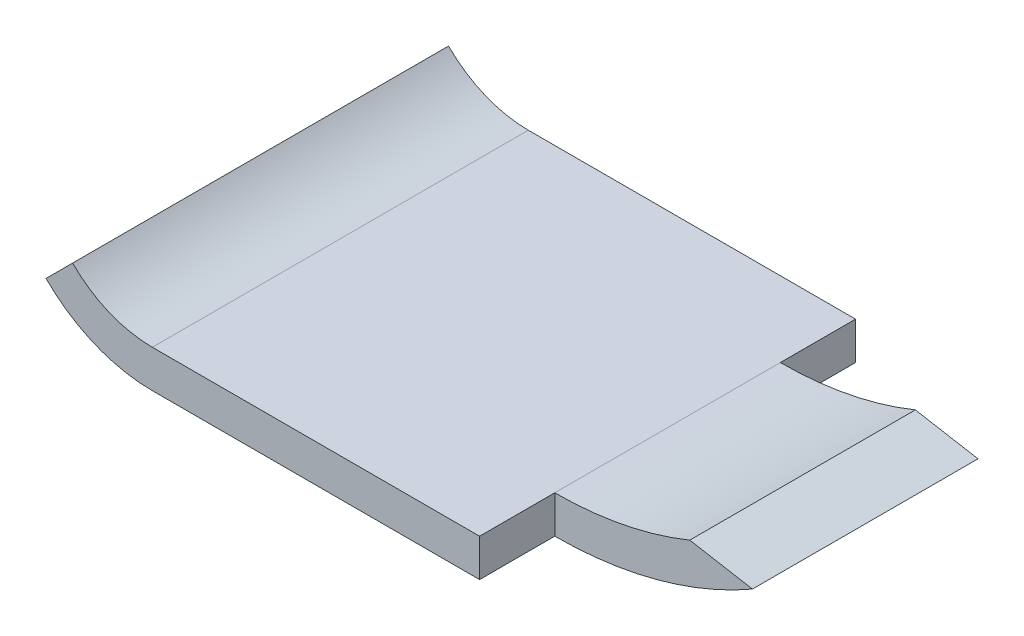
ISO-10303-21;
HEADER;
FILE_DESCRIPTION(('STEP AP214'),'2;1');
FILE_NAME('part.step','',(''),(''),'','','');
FILE_SCHEMA(('AUTOMOTIVE_DESIGN { 1 0 10303 214 1 1 1 1 }'));
ENDSEC;
DATA;
#1=APPLICATION_CONTEXT('core data for automotive mechanical design processes');
#2=APPLICATION_PROTOCOL_DEFINITION('international standard','automotive_design',2000,#1);
#3=PRODUCT_CONTEXT('',#1,'mechanical');
#4=PRODUCT('Part','Part','',(#3));
#5=PRODUCT_RELATED_PRODUCT_CATEGORY('part','',(#4));
#6=PRODUCT_DEFINITION_FORMATION('','',#4);
#7=PRODUCT_DEFINITION_CONTEXT('part definition',#1,'design');
#8=PRODUCT_DEFINITION('design','',#6,#7);
#9=PRODUCT_DEFINITION_SHAPE('','',#8);
#10=(LENGTH_UNIT() NAMED_UNIT(*) SI_UNIT(.MILLI.,.METRE.));
#11=(NAMED_UNIT(*) PLANE_ANGLE_UNIT() SI_UNIT($,.RADIAN.));
#12=(NAMED_UNIT(*) SI_UNIT($,.STERADIAN.) SOLID_ANGLE_UNIT());
#13=UNCERTAINTY_MEASURE_WITH_UNIT(LENGTH_MEASURE(1.E-05),#10,'distance_accuracy_value','');
#14=(GEOMETRIC_REPRESENTATION_CONTEXT(3) GLOBAL_UNCERTAINTY_ASSIGNED_CONTEXT((#13)) GLOBAL_UNIT_ASSIGNED_CONTEXT((#10,
#11,#12)) REPRESENTATION_CONTEXT('',''));
#15=CARTESIAN_POINT('',(0.,0.,0.));
#16=DIRECTION('',(0.,0.,1.));
#17=DIRECTION('',(1.,0.,0.));
#18=AXIS2_PLACEMENT_3D('',#15,#16,#17);
#19=CARTESIAN_POINT('',(6.9088,16.66875,9.525));
#20=DIRECTION('',(0.,0.,-1.));
#21=DIRECTION('',(-1.,0.,0.));
#22=AXIS2_PLACEMENT_3D('',#19,#20,#21);
#23=CYLINDRICAL_SURFACE('',#22,16.66875);
#24=CARTESIAN_POINT('',(6.9088,16.66875,0.));
#25=DIRECTION('',(0.,0.,1.));
#26=DIRECTION('',(1.,0.,0.));
#27=AXIS2_PLACEMENT_3D('',#24,#25,#26);
#28=CIRCLE('',#27,16.66875);
#29=CARTESIAN_POINT('',(6.9088,0.,0.));
#30=VERTEX_POINT('',#29);
#31=CARTESIAN_POINT('',(15.2545410016863,2.2397571836156,0.));
#32=VERTEX_POINT('',#31);
#33=EDGE_CURVE('E179',#30,#32,#28,.T.);
#34=ORIENTED_EDGE('',*,*,#33,.T.);
#35=DIRECTION('',(0.,0.,-1.));
#36=VECTOR('',#35,1.);
#37=CARTESIAN_POINT('',(15.2545410016863,2.2397571836156,9.525));
#38=LINE('',#37,#36);
#39=CARTESIAN_POINT('',(15.2545410016863,2.2397571836156,9.525));
#40=VERTEX_POINT('',#39);
#41=EDGE_CURVE('E11',#40,#32,#38,.T.);
#42=ORIENTED_EDGE('',*,*,#41,.F.);
#43=CARTESIAN_POINT('',(6.9088,16.66875,9.525));
#44=DIRECTION('',(0.,0.,1.));
#45=DIRECTION('',(1.,0.,0.));
#46=AXIS2_PLACEMENT_3D('',#43,#44,#45);
#47=CIRCLE('',#46,16.66875);
#48=CARTESIAN_POINT('',(6.9088,0.,9.525));
#49=VERTEX_POINT('',#48);
#50=EDGE_CURVE('E180',#49,#40,#47,.T.);
#51=ORIENTED_EDGE('',*,*,#50,.F.);
#52=DIRECTION('',(0.,0.,-1.));
#53=VECTOR('',#52,1.);
#54=CARTESIAN_POINT('',(6.9088,0.,9.525));
#55=LINE('',#54,#53);
#56=EDGE_CURVE('E186',#49,#30,#55,.T.);
#57=ORIENTED_EDGE('',*,*,#56,.T.);
#58=EDGE_LOOP('',(#34,#42,#51,#57));
#59=FACE_BOUND('',#58,.T.);
#60=ADVANCED_FACE('F33',(#59),#23,.T.);
#61=CARTESIAN_POINT('',(15.2545410016863,2.2397571836156,9.525));
#62=DIRECTION('',(-0.173648177666923,-0.984807753012209,0.));
#63=DIRECTION('',(0.984807753012209,-0.173648177666923,0.));
#64=AXIS2_PLACEMENT_3D('',#61,#62,#63);
#65=PLANE('',#64);
#66=DIRECTION('',(-0.984807753012209,0.173648177666923,0.));
#67=VECTOR('',#66,1.);
#68=CARTESIAN_POINT('',(15.2545410016863,2.2397571836156,0.));
#69=LINE('',#68,#67);
#70=CARTESIAN_POINT('',(12.6090039545991,2.70623674348085,0.));
#71=VERTEX_POINT('',#70);
#72=EDGE_CURVE('E63',#32,#71,#69,.T.);
#73=ORIENTED_EDGE('',*,*,#72,.T.);
#74=DIRECTION('',(0.,0.,-1.));
#75=VECTOR('',#74,1.);
#76=CARTESIAN_POINT('',(12.6090039545991,2.70623674348085,9.525));
#77=LINE('',#76,#75);
#78=CARTESIAN_POINT('',(12.6090039545991,2.70623674348085,9.525));
#79=VERTEX_POINT('',#78);
#80=EDGE_CURVE('E41',#79,#71,#77,.T.);
#81=ORIENTED_EDGE('',*,*,#80,.F.);
#82=DIRECTION('',(-0.984807753012209,0.173648177666923,0.));
#83=VECTOR('',#82,1.);
#84=CARTESIAN_POINT('',(15.2545410016863,2.2397571836156,9.525));
#85=LINE('',#84,#83);
#86=EDGE_CURVE('E73',#40,#79,#85,.T.);
#87=ORIENTED_EDGE('',*,*,#86,.F.);
#88=ORIENTED_EDGE('',*,*,#41,.T.);
#89=EDGE_LOOP('',(#73,#81,#87,#88));
#90=FACE_BOUND('',#89,.T.);
#91=ADVANCED_FACE('F237',(#90),#65,.F.);
#92=CARTESIAN_POINT('',(6.9088,16.66875,9.525));
#93=DIRECTION('',(0.,0.,-1.));
#94=DIRECTION('',(-1.,0.,0.));
#95=AXIS2_PLACEMENT_3D('',#92,#93,#94);
#96=CYLINDRICAL_SURFACE('',#95,15.08125);
#97=CARTESIAN_POINT('',(6.9088,16.66875,0.));
#98=DIRECTION('',(0.,0.,-1.));
#99=DIRECTION('',(1.,0.,0.));
#100=AXIS2_PLACEMENT_3D('',#97,#98,#99);
#101=CIRCLE('',#100,15.08125);
#102=CARTESIAN_POINT('',(6.9088,1.5875,0.));
#103=VERTEX_POINT('',#102);
#104=EDGE_CURVE('E182',#71,#103,#101,.T.);
#105=ORIENTED_EDGE('',*,*,#104,.T.);
#106=DIRECTION('',(0.,0.,-1.));
#107=VECTOR('',#106,1.);
#108=CARTESIAN_POINT('',(6.9088,1.5875,9.525));
#109=LINE('',#108,#107);
#110=CARTESIAN_POINT('',(6.9088,1.5875,9.525));
#111=VERTEX_POINT('',#110);
#112=EDGE_CURVE('E128',#111,#103,#109,.T.);
#113=ORIENTED_EDGE('',*,*,#112,.F.);
#114=CARTESIAN_POINT('',(6.9088,16.66875,9.525));
#115=DIRECTION('',(0.,0.,-1.));
#116=DIRECTION('',(1.,0.,0.));
#117=AXIS2_PLACEMENT_3D('',#114,#115,#116);
#118=CIRCLE('',#117,15.08125);
#119=EDGE_CURVE('E184',#79,#111,#118,.T.);
#120=ORIENTED_EDGE('',*,*,#119,.F.);
#121=ORIENTED_EDGE('',*,*,#80,.T.);
#122=EDGE_LOOP('',(#105,#113,#120,#121));
#123=FACE_BOUND('',#122,.T.);
#124=ADVANCED_FACE('F202',(#123),#96,.F.);
#125=CARTESIAN_POINT('',(-6.9088,1.5875,9.525));
#126=DIRECTION('',(0.,-1.,0.));
#127=DIRECTION('',(0.,0.,-1.));
#128=AXIS2_PLACEMENT_3D('',#125,#126,#127);
#129=PLANE('',#128);
#130=ORIENTED_EDGE('',*,*,#112,.T.);
#131=DIRECTION('',(0.,0.,1.));
#132=VECTOR('',#131,1.);
#133=CARTESIAN_POINT('',(6.9088,1.5875,-3.175));
#134=LINE('',#133,#132);
#135=CARTESIAN_POINT('',(6.9088,1.5875,-3.175));
#136=VERTEX_POINT('',#135);
#137=EDGE_CURVE('E70',#136,#103,#134,.T.);
#138=ORIENTED_EDGE('',*,*,#137,.F.);
#139=DIRECTION('',(-1.,0.,0.));
#140=VECTOR('',#139,1.);
#141=CARTESIAN_POINT('',(6.9088,1.5875,-3.175));
#142=LINE('',#141,#140);
#143=CARTESIAN_POINT('',(-6.9088,1.5875,-3.175));
#144=VERTEX_POINT('',#143);
#145=EDGE_CURVE('E135',#136,#144,#142,.T.);
#146=ORIENTED_EDGE('',*,*,#145,.T.);
#147=DIRECTION('',(0.,0.,-1.));
#148=VECTOR('',#147,1.);
#149=CARTESIAN_POINT('',(-6.9088,1.5875,9.525));
#150=LINE('',#149,#148);
#151=CARTESIAN_POINT('',(-6.9088,1.5875,12.7));
#152=VERTEX_POINT('',#151);
#153=EDGE_CURVE('E117',#152,#144,#150,.T.);
#154=ORIENTED_EDGE('',*,*,#153,.F.);
#155=DIRECTION('',(-1.,0.,0.));
#156=VECTOR('',#155,1.);
#157=CARTESIAN_POINT('',(6.9088,1.5875,12.7));
#158=LINE('',#157,#156);
#159=CARTESIAN_POINT('',(6.9088,1.5875,12.7));
#160=VERTEX_POINT('',#159);
#161=EDGE_CURVE('E163',#160,#152,#158,.T.);
#162=ORIENTED_EDGE('',*,*,#161,.F.);
#163=DIRECTION('',(0.,0.,-1.));
#164=VECTOR('',#163,1.);
#165=CARTESIAN_POINT('',(6.9088,1.5875,12.7));
#166=LINE('',#165,#164);
#167=EDGE_CURVE('E172',#160,#111,#166,.T.);
#168=ORIENTED_EDGE('',*,*,#167,.T.);
#169=EDGE_LOOP('',(#130,#138,#146,#154,#162,#168));
#170=FACE_BOUND('',#169,.T.);
#171=ADVANCED_FACE('F142',(#170),#129,.F.);
#172=CARTESIAN_POINT('',(-6.9088,6.35,9.525));
#173=DIRECTION('',(0.,0.,-1.));
#174=DIRECTION('',(-1.,0.,0.));
#175=AXIS2_PLACEMENT_3D('',#172,#173,#174);
#176=CYLINDRICAL_SURFACE('',#175,4.7625);
#177=ORIENTED_EDGE('',*,*,#153,.T.);
#178=CARTESIAN_POINT('',(-6.9088,6.35,-3.175));
#179=DIRECTION('',(0.,0.,1.));
#180=DIRECTION('',(1.,0.,0.));
#181=AXIS2_PLACEMENT_3D('',#178,#179,#180);
#182=CIRCLE('',#181,4.7625);
#183=CARTESIAN_POINT('',(-10.2763960454009,2.98240395459906,-3.175));
#184=VERTEX_POINT('',#183);
#185=EDGE_CURVE('E120',#184,#144,#182,.T.);
#186=ORIENTED_EDGE('',*,*,#185,.F.);
#187=DIRECTION('',(0.,0.,-1.));
#188=VECTOR('',#187,1.);
#189=CARTESIAN_POINT('',(-10.2763960454009,2.98240395459906,9.525));
#190=LINE('',#189,#188);
#191=CARTESIAN_POINT('',(-10.2763960454009,2.98240395459906,12.7));
#192=VERTEX_POINT('',#191);
#193=EDGE_CURVE('E129',#192,#184,#190,.T.);
#194=ORIENTED_EDGE('',*,*,#193,.F.);
#195=CARTESIAN_POINT('',(-6.9088,6.35,12.7));
#196=DIRECTION('',(0.,0.,-1.));
#197=DIRECTION('',(1.,0.,0.));
#198=AXIS2_PLACEMENT_3D('',#195,#196,#197);
#199=CIRCLE('',#198,4.7625);
#200=EDGE_CURVE('E123',#152,#192,#199,.T.);
#201=ORIENTED_EDGE('',*,*,#200,.F.);
#202=EDGE_LOOP('',(#177,#186,#194,#201));
#203=FACE_BOUND('',#202,.T.);
#204=ADVANCED_FACE('F119',(#203),#176,.F.);
#205=CARTESIAN_POINT('',(-11.3989280605346,1.85987193946541,9.525));
#206=DIRECTION('',(0.707106781186549,-0.707106781186546,0.));
#207=DIRECTION('',(0.707106781186546,0.707106781186549,0.));
#208=AXIS2_PLACEMENT_3D('',#205,#206,#207);
#209=PLANE('',#208);
#210=ORIENTED_EDGE('',*,*,#193,.T.);
#211=DIRECTION('',(-0.707106781186543,-0.707106781186552,0.));
#212=VECTOR('',#211,1.);
#213=CARTESIAN_POINT('',(5.1593749999999,18.4181750000001,-3.175));
#214=LINE('',#213,#212);
#215=CARTESIAN_POINT('',(-11.3989280605346,1.85987193946541,-3.175));
#216=VERTEX_POINT('',#215);
#217=EDGE_CURVE('E138',#184,#216,#214,.T.);
#218=ORIENTED_EDGE('',*,*,#217,.T.);
#219=DIRECTION('',(0.,0.,-1.));
#220=VECTOR('',#219,1.);
#221=CARTESIAN_POINT('',(-11.3989280605346,1.85987193946541,9.525));
#222=LINE('',#221,#220);
#223=CARTESIAN_POINT('',(-11.3989280605346,1.85987193946541,12.7));
#224=VERTEX_POINT('',#223);
#225=EDGE_CURVE('E196',#224,#216,#222,.T.);
#226=ORIENTED_EDGE('',*,*,#225,.F.);
#227=DIRECTION('',(-0.707106781186543,-0.707106781186552,0.));
#228=VECTOR('',#227,1.);
#229=CARTESIAN_POINT('',(-10.2763960454009,2.98240395459906,12.7));
#230=LINE('',#229,#228);
#231=EDGE_CURVE('E166',#192,#224,#230,.T.);
#232=ORIENTED_EDGE('',*,*,#231,.F.);
#233=EDGE_LOOP('',(#210,#218,#226,#232));
#234=FACE_BOUND('',#233,.T.);
#235=ADVANCED_FACE('F220',(#234),#209,.F.);
#236=CARTESIAN_POINT('',(-6.9088,6.35,9.525));
#237=DIRECTION('',(0.,0.,-1.));
#238=DIRECTION('',(-1.,0.,0.));
#239=AXIS2_PLACEMENT_3D('',#236,#237,#238);
#240=CYLINDRICAL_SURFACE('',#239,6.35);
#241=ORIENTED_EDGE('',*,*,#225,.T.);
#242=CARTESIAN_POINT('',(-6.9088,6.35,-3.175));
#243=DIRECTION('',(0.,0.,1.));
#244=DIRECTION('',(1.,0.,0.));
#245=AXIS2_PLACEMENT_3D('',#242,#243,#244);
#246=CIRCLE('',#245,6.35);
#247=CARTESIAN_POINT('',(-6.9088,0.,-3.175));
#248=VERTEX_POINT('',#247);
#249=EDGE_CURVE('E150',#216,#248,#246,.T.);
#250=ORIENTED_EDGE('',*,*,#249,.T.);
#251=DIRECTION('',(0.,0.,-1.));
#252=VECTOR('',#251,1.);
#253=CARTESIAN_POINT('',(-6.9088,0.,9.525));
#254=LINE('',#253,#252);
#255=CARTESIAN_POINT('',(-6.9088,0.,12.7));
#256=VERTEX_POINT('',#255);
#257=EDGE_CURVE('E194',#256,#248,#254,.T.);
#258=ORIENTED_EDGE('',*,*,#257,.F.);
#259=CARTESIAN_POINT('',(-6.9088,6.35,12.7));
#260=DIRECTION('',(0.,0.,1.));
#261=DIRECTION('',(1.,0.,0.));
#262=AXIS2_PLACEMENT_3D('',#259,#260,#261);
#263=CIRCLE('',#262,6.35);
#264=EDGE_CURVE('E169',#224,#256,#263,.T.);
#265=ORIENTED_EDGE('',*,*,#264,.F.);
#266=EDGE_LOOP('',(#241,#250,#258,#265));
#267=FACE_BOUND('',#266,.T.);
#268=ADVANCED_FACE('F216',(#267),#240,.T.);
#269=CARTESIAN_POINT('',(-6.9088,0.,9.525));
#270=DIRECTION('',(0.,1.,0.));
#271=DIRECTION('',(0.,0.,1.));
#272=AXIS2_PLACEMENT_3D('',#269,#270,#271);
#273=PLANE('',#272);
#274=ORIENTED_EDGE('',*,*,#257,.T.);
#275=DIRECTION('',(1.,0.,0.));
#276=VECTOR('',#275,1.);
#277=CARTESIAN_POINT('',(6.9088,0.,-3.175));
#278=LINE('',#277,#276);
#279=CARTESIAN_POINT('',(6.9088,0.,-3.175));
#280=VERTEX_POINT('',#279);
#281=EDGE_CURVE('E145',#248,#280,#278,.T.);
#282=ORIENTED_EDGE('',*,*,#281,.T.);
#283=DIRECTION('',(0.,0.,1.));
#284=VECTOR('',#283,1.);
#285=CARTESIAN_POINT('',(6.9088,0.,-3.175));
#286=LINE('',#285,#284);
#287=EDGE_CURVE('E154',#280,#30,#286,.T.);
#288=ORIENTED_EDGE('',*,*,#287,.T.);
#289=ORIENTED_EDGE('',*,*,#56,.F.);
#290=DIRECTION('',(0.,0.,-1.));
#291=VECTOR('',#290,1.);
#292=CARTESIAN_POINT('',(6.9088,0.,12.7));
#293=LINE('',#292,#291);
#294=CARTESIAN_POINT('',(6.9088,0.,12.7));
#295=VERTEX_POINT('',#294);
#296=EDGE_CURVE('E176',#295,#49,#293,.T.);
#297=ORIENTED_EDGE('',*,*,#296,.F.);
#298=DIRECTION('',(1.,0.,0.));
#299=VECTOR('',#298,1.);
#300=CARTESIAN_POINT('',(-6.9088,0.,12.7));
#301=LINE('',#300,#299);
#302=EDGE_CURVE('E158',#256,#295,#301,.T.);
#303=ORIENTED_EDGE('',*,*,#302,.F.);
#304=EDGE_LOOP('',(#274,#282,#288,#289,#297,#303));
#305=FACE_BOUND('',#304,.T.);
#306=ADVANCED_FACE('F212',(#305),#273,.F.);
#307=CARTESIAN_POINT('',(6.9088,16.66875,9.525));
#308=DIRECTION('',(0.,0.,1.));
#309=DIRECTION('',(1.,0.,0.));
#310=AXIS2_PLACEMENT_3D('',#307,#308,#309);
#311=PLANE('',#310);
#312=DIRECTION('',(0.,1.,0.));
#313=VECTOR('',#312,1.);
#314=CARTESIAN_POINT('',(6.9088,0.,9.525));
#315=LINE('',#314,#313);
#316=EDGE_CURVE('E49',#49,#111,#315,.T.);
#317=ORIENTED_EDGE('',*,*,#316,.F.);
#318=ORIENTED_EDGE('',*,*,#50,.T.);
#319=ORIENTED_EDGE('',*,*,#86,.T.);
#320=ORIENTED_EDGE('',*,*,#119,.T.);
#321=EDGE_LOOP('',(#317,#318,#319,#320));
#322=FACE_BOUND('',#321,.T.);
#323=ADVANCED_FACE('F233',(#322),#311,.T.);
#324=CARTESIAN_POINT('',(6.9088,16.66875,0.));
#325=DIRECTION('',(0.,0.,1.));
#326=DIRECTION('',(1.,0.,0.));
#327=AXIS2_PLACEMENT_3D('',#324,#325,#326);
#328=PLANE('',#327);
#329=ORIENTED_EDGE('',*,*,#33,.F.);
#330=DIRECTION('',(0.,1.,0.));
#331=VECTOR('',#330,1.);
#332=CARTESIAN_POINT('',(6.90880000000001,16.66875,0.));
#333=LINE('',#332,#331);
#334=EDGE_CURVE('E139',#30,#103,#333,.T.);
#335=ORIENTED_EDGE('',*,*,#334,.T.);
#336=ORIENTED_EDGE('',*,*,#104,.F.);
#337=ORIENTED_EDGE('',*,*,#72,.F.);
#338=EDGE_LOOP('',(#329,#335,#336,#337));
#339=FACE_BOUND('',#338,.T.);
#340=ADVANCED_FACE('F205',(#339),#328,.F.);
#341=CARTESIAN_POINT('',(6.9088,0.,12.7));
#342=DIRECTION('',(-1.,0.,0.));
#343=DIRECTION('',(0.,-1.,0.));
#344=AXIS2_PLACEMENT_3D('',#341,#342,#343);
#345=PLANE('',#344);
#346=ORIENTED_EDGE('',*,*,#316,.T.);
#347=ORIENTED_EDGE('',*,*,#167,.F.);
#348=DIRECTION('',(0.,1.,0.));
#349=VECTOR('',#348,1.);
#350=CARTESIAN_POINT('',(6.9088,0.,12.7));
#351=LINE('',#350,#349);
#352=EDGE_CURVE('E161',#295,#160,#351,.T.);
#353=ORIENTED_EDGE('',*,*,#352,.F.);
#354=ORIENTED_EDGE('',*,*,#296,.T.);
#355=EDGE_LOOP('',(#346,#347,#353,#354));
#356=FACE_BOUND('',#355,.T.);
#357=ADVANCED_FACE('F225',(#356),#345,.F.);
#358=CARTESIAN_POINT('',(-6.9088,6.35,12.7));
#359=DIRECTION('',(0.,0.,1.));
#360=DIRECTION('',(1.,0.,0.));
#361=AXIS2_PLACEMENT_3D('',#358,#359,#360);
#362=PLANE('',#361);
#363=ORIENTED_EDGE('',*,*,#302,.T.);
#364=ORIENTED_EDGE('',*,*,#352,.T.);
#365=ORIENTED_EDGE('',*,*,#161,.T.);
#366=ORIENTED_EDGE('',*,*,#200,.T.);
#367=ORIENTED_EDGE('',*,*,#231,.T.);
#368=ORIENTED_EDGE('',*,*,#264,.T.);
#369=EDGE_LOOP('',(#363,#364,#365,#366,#367,#368));
#370=FACE_BOUND('',#369,.T.);
#371=ADVANCED_FACE('F222',(#370),#362,.T.);
#372=CARTESIAN_POINT('',(6.90880000000001,16.66875,-3.175));
#373=DIRECTION('',(1.,0.,0.));
#374=DIRECTION('',(0.,1.,0.));
#375=AXIS2_PLACEMENT_3D('',#372,#373,#374);
#376=PLANE('',#375);
#377=ORIENTED_EDGE('',*,*,#334,.F.);
#378=ORIENTED_EDGE('',*,*,#287,.F.);
#379=DIRECTION('',(0.,1.,0.));
#380=VECTOR('',#379,1.);
#381=CARTESIAN_POINT('',(6.90880000000001,16.66875,-3.175));
#382=LINE('',#381,#380);
#383=EDGE_CURVE('E143',#280,#136,#382,.T.);
#384=ORIENTED_EDGE('',*,*,#383,.T.);
#385=ORIENTED_EDGE('',*,*,#137,.T.);
#386=EDGE_LOOP('',(#377,#378,#384,#385));
#387=FACE_BOUND('',#386,.T.);
#388=ADVANCED_FACE('F206',(#387),#376,.T.);
#389=CARTESIAN_POINT('',(-6.9088,6.35,-3.175));
#390=DIRECTION('',(0.,0.,1.));
#391=DIRECTION('',(1.,0.,0.));
#392=AXIS2_PLACEMENT_3D('',#389,#390,#391);
#393=PLANE('',#392);
#394=ORIENTED_EDGE('',*,*,#185,.T.);
#395=ORIENTED_EDGE('',*,*,#145,.F.);
#396=ORIENTED_EDGE('',*,*,#383,.F.);
#397=ORIENTED_EDGE('',*,*,#281,.F.);
#398=ORIENTED_EDGE('',*,*,#249,.F.);
#399=ORIENTED_EDGE('',*,*,#217,.F.);
#400=EDGE_LOOP('',(#394,#395,#396,#397,#398,#399));
#401=FACE_BOUND('',#400,.T.);
#402=ADVANCED_FACE('F133',(#401),#393,.F.);
#403=CLOSED_SHELL('',(#60,#91,#124,#171,#204,#235,#268,#306,#323,#340,#357,#371,#388,#402));
#404=MANIFOLD_SOLID_BREP('B2',#403);
#405=ADVANCED_BREP_SHAPE_REPRESENTATION('',(#18,#404),#14);
#406=SHAPE_DEFINITION_REPRESENTATION(#9,#405);
ENDSEC;
END-ISO-10303-21;
